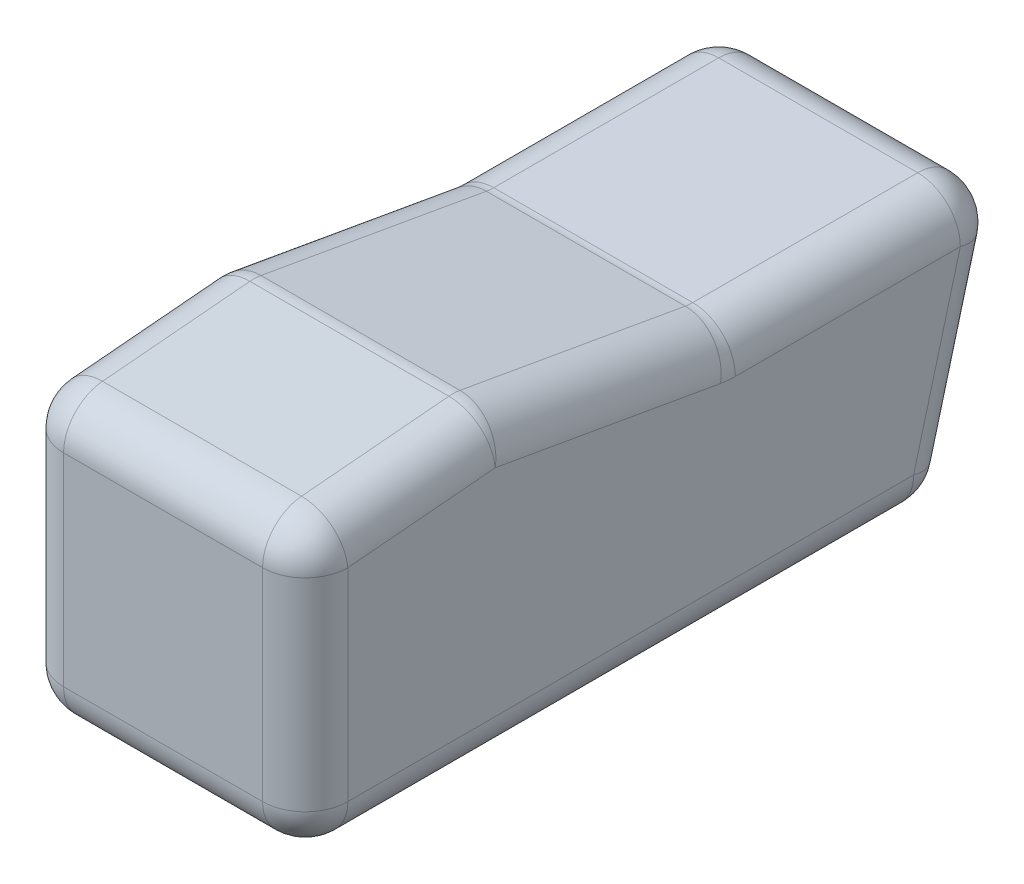
ISO-10303-21;
HEADER;
FILE_DESCRIPTION(('STEP AP214'),'2;1');
FILE_NAME('part.step','',(''),(''),'','','');
FILE_SCHEMA(('AUTOMOTIVE_DESIGN { 1 0 10303 214 1 1 1 1 }'));
ENDSEC;
DATA;
#1=APPLICATION_CONTEXT('core data for automotive mechanical design processes');
#2=APPLICATION_PROTOCOL_DEFINITION('international standard','automotive_design',2000,#1);
#3=PRODUCT_CONTEXT('',#1,'mechanical');
#4=PRODUCT('Part','Part','',(#3));
#5=PRODUCT_RELATED_PRODUCT_CATEGORY('part','',(#4));
#6=PRODUCT_DEFINITION_FORMATION('','',#4);
#7=PRODUCT_DEFINITION_CONTEXT('part definition',#1,'design');
#8=PRODUCT_DEFINITION('design','',#6,#7);
#9=PRODUCT_DEFINITION_SHAPE('','',#8);
#10=(LENGTH_UNIT() NAMED_UNIT(*) SI_UNIT(.MILLI.,.METRE.));
#11=(NAMED_UNIT(*) PLANE_ANGLE_UNIT() SI_UNIT($,.RADIAN.));
#12=(NAMED_UNIT(*) SI_UNIT($,.STERADIAN.) SOLID_ANGLE_UNIT());
#13=UNCERTAINTY_MEASURE_WITH_UNIT(LENGTH_MEASURE(1.E-05),#10,'distance_accuracy_value','');
#14=(GEOMETRIC_REPRESENTATION_CONTEXT(3) GLOBAL_UNCERTAINTY_ASSIGNED_CONTEXT((#13)) GLOBAL_UNIT_ASSIGNED_CONTEXT((#10,
#11,#12)) REPRESENTATION_CONTEXT('',''));
#15=CARTESIAN_POINT('',(0.,0.,0.));
#16=DIRECTION('',(0.,0.,1.));
#17=DIRECTION('',(1.,0.,0.));
#18=AXIS2_PLACEMENT_3D('',#15,#16,#17);
#19=CARTESIAN_POINT('',(-1000.,1000.,-500.));
#20=DIRECTION('',(0.,-0.996194698091746,-0.0871557427476548));
#21=DIRECTION('',(0.,0.0871557427476548,-0.996194698091746));
#22=AXIS2_PLACEMENT_3D('',#19,#20,#21);
#23=PLANE('',#22);
#24=DIRECTION('',(1.,0.,0.));
#25=VECTOR('',#24,1.);
#26=CARTESIAN_POINT('',(-1000.,1114.66741439645,-1810.65454397387));
#27=LINE('',#26,#25);
#28=CARTESIAN_POINT('',(700.,1114.66741439645,-1810.65454397387));
#29=VERTEX_POINT('',#28);
#30=CARTESIAN_POINT('',(-700.,1114.66741439645,-1810.65454397387));
#31=VERTEX_POINT('',#30);
#32=EDGE_CURVE('E49',#29,#31,#27,.F.);
#33=ORIENTED_EDGE('',*,*,#32,.T.);
#34=DIRECTION('',(0.,0.0871557427476548,-0.996194698091746));
#35=VECTOR('',#34,1.);
#36=CARTESIAN_POINT('',(-700.,1000.,-500.));
#37=LINE('',#36,#35);
#38=CARTESIAN_POINT('',(-700.,1023.9590572223,-773.853277175704));
#39=VERTEX_POINT('',#38);
#40=EDGE_CURVE('E11',#31,#39,#37,.F.);
#41=ORIENTED_EDGE('',*,*,#40,.T.);
#42=DIRECTION('',(1.,0.,0.));
#43=VECTOR('',#42,1.);
#44=CARTESIAN_POINT('',(-1000.,1023.9590572223,-773.853277175704));
#45=LINE('',#44,#43);
#46=CARTESIAN_POINT('',(700.,1023.9590572223,-773.853277175704));
#47=VERTEX_POINT('',#46);
#48=EDGE_CURVE('E358',#39,#47,#45,.T.);
#49=ORIENTED_EDGE('',*,*,#48,.T.);
#50=DIRECTION('',(0.,0.0871557427476548,-0.996194698091746));
#51=VECTOR('',#50,1.);
#52=CARTESIAN_POINT('',(700.,1118.10969575999,-1850.));
#53=LINE('',#52,#51);
#54=EDGE_CURVE('E60',#47,#29,#53,.T.);
#55=ORIENTED_EDGE('',*,*,#54,.T.);
#56=EDGE_LOOP('',(#33,#41,#49,#55));
#57=FACE_BOUND('',#56,.T.);
#58=ADVANCED_FACE('F39',(#57),#23,.F.);
#59=CARTESIAN_POINT('',(-1000.,1118.10969575999,-1850.));
#60=DIRECTION('',(0.,-0.984807753012207,0.173648177666934));
#61=DIRECTION('',(0.,-0.173648177666934,-0.984807753012207));
#62=AXIS2_PLACEMENT_3D('',#59,#60,#61);
#63=PLANE('',#62);
#64=DIRECTION('',(1.,0.,0.));
#65=VECTOR('',#64,1.);
#66=CARTESIAN_POINT('',(-1000.,831.727851687357,-3474.1521457577));
#67=LINE('',#66,#65);
#68=CARTESIAN_POINT('',(700.,831.727851687357,-3474.1521457577));
#69=VERTEX_POINT('',#68);
#70=CARTESIAN_POINT('',(-700.,831.727851687357,-3474.1521457577));
#71=VERTEX_POINT('',#70);
#72=EDGE_CURVE('E351',#69,#71,#67,.F.);
#73=ORIENTED_EDGE('',*,*,#72,.T.);
#74=DIRECTION('',(0.,-0.173648177666934,-0.984807753012207));
#75=VECTOR('',#74,1.);
#76=CARTESIAN_POINT('',(-700.,1118.10969575999,-1850.));
#77=LINE('',#76,#75);
#78=CARTESIAN_POINT('',(-700.,1111.25133087259,-1888.89572009825));
#79=VERTEX_POINT('',#78);
#80=EDGE_CURVE('E354',#71,#79,#77,.F.);
#81=ORIENTED_EDGE('',*,*,#80,.T.);
#82=DIRECTION('',(1.,0.,0.));
#83=VECTOR('',#82,1.);
#84=CARTESIAN_POINT('',(-1000.,1111.25133087259,-1888.89572009825));
#85=LINE('',#84,#83);
#86=CARTESIAN_POINT('',(700.,1111.25133087259,-1888.89572009825));
#87=VERTEX_POINT('',#86);
#88=EDGE_CURVE('E340',#79,#87,#85,.T.);
#89=ORIENTED_EDGE('',*,*,#88,.T.);
#90=DIRECTION('',(0.,-0.173648177666934,-0.984807753012207));
#91=VECTOR('',#90,1.);
#92=CARTESIAN_POINT('',(700.,827.170177591019,-3500.));
#93=LINE('',#92,#91);
#94=EDGE_CURVE('E344',#87,#69,#93,.T.);
#95=ORIENTED_EDGE('',*,*,#94,.T.);
#96=EDGE_LOOP('',(#73,#81,#89,#95));
#97=FACE_BOUND('',#96,.T.);
#98=ADVANCED_FACE('F513',(#97),#63,.F.);
#99=CARTESIAN_POINT('',(-1000.,827.170177591019,-3500.));
#100=DIRECTION('',(0.,-1.,0.));
#101=DIRECTION('',(0.,0.,-1.));
#102=AXIS2_PLACEMENT_3D('',#99,#100,#101);
#103=PLANE('',#102);
#104=DIRECTION('',(1.,0.,0.));
#105=VECTOR('',#104,1.);
#106=CARTESIAN_POINT('',(-1000.,827.170177591019,-5109.03238814764));
#107=LINE('',#106,#105);
#108=CARTESIAN_POINT('',(700.,827.170177591019,-5109.03238814764));
#109=VERTEX_POINT('',#108);
#110=CARTESIAN_POINT('',(-700.,827.170177591019,-5109.03238814764));
#111=VERTEX_POINT('',#110);
#112=EDGE_CURVE('E335',#109,#111,#107,.F.);
#113=ORIENTED_EDGE('',*,*,#112,.T.);
#114=DIRECTION('',(0.,0.,-1.));
#115=VECTOR('',#114,1.);
#116=CARTESIAN_POINT('',(-700.,827.170177591019,-3500.));
#117=LINE('',#116,#115);
#118=CARTESIAN_POINT('',(-700.,827.170177591019,-3526.24659905778));
#119=VERTEX_POINT('',#118);
#120=EDGE_CURVE('E332',#111,#119,#117,.F.);
#121=ORIENTED_EDGE('',*,*,#120,.T.);
#122=DIRECTION('',(1.,0.,0.));
#123=VECTOR('',#122,1.);
#124=CARTESIAN_POINT('',(1000.,827.170177591019,-3526.24659905778));
#125=LINE('',#124,#123);
#126=CARTESIAN_POINT('',(700.,827.170177591019,-3526.24659905778));
#127=VERTEX_POINT('',#126);
#128=EDGE_CURVE('E324',#119,#127,#125,.T.);
#129=ORIENTED_EDGE('',*,*,#128,.T.);
#130=DIRECTION('',(0.,0.,-1.));
#131=VECTOR('',#130,1.);
#132=CARTESIAN_POINT('',(700.,827.170177591019,-5500.));
#133=LINE('',#132,#131);
#134=EDGE_CURVE('E328',#127,#109,#133,.T.);
#135=ORIENTED_EDGE('',*,*,#134,.T.);
#136=EDGE_LOOP('',(#113,#121,#129,#135));
#137=FACE_BOUND('',#136,.T.);
#138=ADVANCED_FACE('F333',(#137),#103,.F.);
#139=CARTESIAN_POINT('',(-1000.,827.170177591019,-5500.));
#140=DIRECTION('',(0.,0.258819045102525,0.965925826289067));
#141=DIRECTION('',(0.,-0.965925826289067,0.258819045102525));
#142=AXIS2_PLACEMENT_3D('',#139,#140,#141);
#143=PLANE('',#142);
#144=DIRECTION('',(1.,0.,0.));
#145=VECTOR('',#144,1.);
#146=CARTESIAN_POINT('',(-1000.,-777.645713530757,-5069.99087797328));
#147=LINE('',#146,#145);
#148=CARTESIAN_POINT('',(700.,-777.645713530757,-5069.99087797328));
#149=VERTEX_POINT('',#148);
#150=CARTESIAN_POINT('',(-700.,-777.645713530757,-5069.99087797328));
#151=VERTEX_POINT('',#150);
#152=EDGE_CURVE('E441',#149,#151,#147,.F.);
#153=ORIENTED_EDGE('',*,*,#152,.T.);
#154=DIRECTION('',(0.,-0.965925826289067,0.258819045102525));
#155=VECTOR('',#154,1.);
#156=CARTESIAN_POINT('',(-700.,827.170177591019,-5500.));
#157=LINE('',#156,#155);
#158=CARTESIAN_POINT('',(-700.,449.524464060261,-5398.81013603436));
#159=VERTEX_POINT('',#158);
#160=EDGE_CURVE('E444',#151,#159,#157,.F.);
#161=ORIENTED_EDGE('',*,*,#160,.T.);
#162=DIRECTION('',(1.,0.,0.));
#163=VECTOR('',#162,1.);
#164=CARTESIAN_POINT('',(-1000.,449.524464060261,-5398.81013603436));
#165=LINE('',#164,#163);
#166=CARTESIAN_POINT('',(700.,449.524464060261,-5398.81013603436));
#167=VERTEX_POINT('',#166);
#168=EDGE_CURVE('E435',#159,#167,#165,.T.);
#169=ORIENTED_EDGE('',*,*,#168,.T.);
#170=DIRECTION('',(0.,-0.965925826289067,0.258819045102525));
#171=VECTOR('',#170,1.);
#172=CARTESIAN_POINT('',(700.,-1000.,-5010.41122648025));
#173=LINE('',#172,#171);
#174=EDGE_CURVE('E438',#167,#149,#173,.T.);
#175=ORIENTED_EDGE('',*,*,#174,.T.);
#176=EDGE_LOOP('',(#153,#161,#169,#175));
#177=FACE_BOUND('',#176,.T.);
#178=ADVANCED_FACE('F488',(#177),#143,.F.);
#179=CARTESIAN_POINT('',(-1000.,-1000.,-5010.41122648025));
#180=DIRECTION('',(0.,1.,0.));
#181=DIRECTION('',(0.,0.,1.));
#182=AXIS2_PLACEMENT_3D('',#179,#180,#181);
#183=PLANE('',#182);
#184=DIRECTION('',(0.,0.,1.));
#185=VECTOR('',#184,1.);
#186=CARTESIAN_POINT('',(700.,-1000.,-500.));
#187=LINE('',#186,#185);
#188=CARTESIAN_POINT('',(700.,-1000.,-4780.21313008656));
#189=VERTEX_POINT('',#188);
#190=CARTESIAN_POINT('',(700.,-1000.,-800.));
#191=VERTEX_POINT('',#190);
#192=EDGE_CURVE('E405',#189,#191,#187,.T.);
#193=ORIENTED_EDGE('',*,*,#192,.T.);
#194=DIRECTION('',(1.,0.,0.));
#195=VECTOR('',#194,1.);
#196=CARTESIAN_POINT('',(-1000.,-1000.,-800.));
#197=LINE('',#196,#195);
#198=CARTESIAN_POINT('',(-700.,-1000.,-800.));
#199=VERTEX_POINT('',#198);
#200=EDGE_CURVE('E399',#191,#199,#197,.F.);
#201=ORIENTED_EDGE('',*,*,#200,.T.);
#202=DIRECTION('',(0.,0.,1.));
#203=VECTOR('',#202,1.);
#204=CARTESIAN_POINT('',(-700.,-1000.,-5010.41122648025));
#205=LINE('',#204,#203);
#206=CARTESIAN_POINT('',(-700.,-1000.,-4780.21313008656));
#207=VERTEX_POINT('',#206);
#208=EDGE_CURVE('E392',#199,#207,#205,.F.);
#209=ORIENTED_EDGE('',*,*,#208,.T.);
#210=DIRECTION('',(1.,0.,0.));
#211=VECTOR('',#210,1.);
#212=CARTESIAN_POINT('',(-1000.,-1000.,-4780.21313008656));
#213=LINE('',#212,#211);
#214=EDGE_CURVE('E400',#207,#189,#213,.T.);
#215=ORIENTED_EDGE('',*,*,#214,.T.);
#216=EDGE_LOOP('',(#193,#201,#209,#215));
#217=FACE_BOUND('',#216,.T.);
#218=ADVANCED_FACE('F403',(#217),#183,.F.);
#219=CARTESIAN_POINT('',(-1000.,-1000.,-500.));
#220=DIRECTION('',(0.,0.,-1.));
#221=DIRECTION('',(-1.,0.,0.));
#222=AXIS2_PLACEMENT_3D('',#219,#220,#221);
#223=PLANE('',#222);
#224=DIRECTION('',(0.,1.,0.));
#225=VECTOR('',#224,1.);
#226=CARTESIAN_POINT('',(-700.,-1000.,-500.));
#227=LINE('',#226,#225);
#228=CARTESIAN_POINT('',(-700.,725.100647794772,-500.));
#229=VERTEX_POINT('',#228);
#230=CARTESIAN_POINT('',(-700.,-700.,-500.));
#231=VERTEX_POINT('',#230);
#232=EDGE_CURVE('E181',#229,#231,#227,.F.);
#233=ORIENTED_EDGE('',*,*,#232,.T.);
#234=DIRECTION('',(1.,0.,0.));
#235=VECTOR('',#234,1.);
#236=CARTESIAN_POINT('',(-1000.,-700.,-500.));
#237=LINE('',#236,#235);
#238=CARTESIAN_POINT('',(700.,-700.,-500.));
#239=VERTEX_POINT('',#238);
#240=EDGE_CURVE('E176',#231,#239,#237,.T.);
#241=ORIENTED_EDGE('',*,*,#240,.T.);
#242=DIRECTION('',(0.,1.,0.));
#243=VECTOR('',#242,1.);
#244=CARTESIAN_POINT('',(700.,1000.,-500.));
#245=LINE('',#244,#243);
#246=CARTESIAN_POINT('',(700.,725.100647794772,-500.));
#247=VERTEX_POINT('',#246);
#248=EDGE_CURVE('E170',#239,#247,#245,.T.);
#249=ORIENTED_EDGE('',*,*,#248,.T.);
#250=DIRECTION('',(1.,0.,0.));
#251=VECTOR('',#250,1.);
#252=CARTESIAN_POINT('',(-1000.,725.100647794772,-500.));
#253=LINE('',#252,#251);
#254=EDGE_CURVE('E173',#247,#229,#253,.F.);
#255=ORIENTED_EDGE('',*,*,#254,.T.);
#256=EDGE_LOOP('',(#233,#241,#249,#255));
#257=FACE_BOUND('',#256,.T.);
#258=ADVANCED_FACE('F172',(#257),#223,.F.);
#259=CARTESIAN_POINT('',(-1000.,0.,0.));
#260=DIRECTION('',(1.,0.,0.));
#261=DIRECTION('',(0.,0.,-1.));
#262=AXIS2_PLACEMENT_3D('',#259,#260,#261);
#263=PLANE('',#262);
#264=DIRECTION('',(0.,-0.965925826289067,0.258819045102525));
#265=VECTOR('',#264,1.);
#266=CARTESIAN_POINT('',(-1000.,-1241.9443911971,-4634.99956812272));
#267=LINE('',#266,#265);
#268=CARTESIAN_POINT('',(-1000.,527.170177591019,-5109.03238814764));
#269=VERTEX_POINT('',#268);
#270=CARTESIAN_POINT('',(-1000.,-700.,-4780.21313008656));
#271=VERTEX_POINT('',#270);
#272=EDGE_CURVE('E429',#269,#271,#267,.T.);
#273=ORIENTED_EDGE('',*,*,#272,.T.);
#274=DIRECTION('',(0.,0.,1.));
#275=VECTOR('',#274,1.);
#276=CARTESIAN_POINT('',(-1000.,-700.,0.));
#277=LINE('',#276,#275);
#278=CARTESIAN_POINT('',(-1000.,-700.,-800.));
#279=VERTEX_POINT('',#278);
#280=EDGE_CURVE('E432',#271,#279,#277,.T.);
#281=ORIENTED_EDGE('',*,*,#280,.T.);
#282=DIRECTION('',(0.,1.,0.));
#283=VECTOR('',#282,1.);
#284=CARTESIAN_POINT('',(-1000.,0.,-800.));
#285=LINE('',#284,#283);
#286=CARTESIAN_POINT('',(-1000.,725.100647794772,-800.));
#287=VERTEX_POINT('',#286);
#288=EDGE_CURVE('E419',#279,#287,#285,.T.);
#289=ORIENTED_EDGE('',*,*,#288,.T.);
#290=DIRECTION('',(0.,0.0871557427476548,-0.996194698091746));
#291=VECTOR('',#290,1.);
#292=CARTESIAN_POINT('',(-1000.,650.13342266185,56.8793042622177));
#293=LINE('',#292,#291);
#294=CARTESIAN_POINT('',(-1000.,815.809004968925,-1836.80126679817));
#295=VERTEX_POINT('',#294);
#296=EDGE_CURVE('E410',#287,#295,#293,.T.);
#297=ORIENTED_EDGE('',*,*,#296,.T.);
#298=DIRECTION('',(0.,-0.173648177666934,-0.984807753012207));
#299=VECTOR('',#298,1.);
#300=CARTESIAN_POINT('',(-1000.,1105.32086972,-194.897891671787));
#301=LINE('',#300,#299);
#302=CARTESIAN_POINT('',(-1000.,536.285525783694,-3422.05769245762));
#303=VERTEX_POINT('',#302);
#304=EDGE_CURVE('E413',#295,#303,#301,.T.);
#305=ORIENTED_EDGE('',*,*,#304,.T.);
#306=CARTESIAN_POINT('',(-1000.,1127.17017759102,-3526.24659905778));
#307=DIRECTION('',(1.,0.,0.));
#308=DIRECTION('',(0.,0.,-1.));
#309=AXIS2_PLACEMENT_3D('',#306,#307,#308);
#310=CIRCLE('',#309,600.);
#311=CARTESIAN_POINT('',(-1000.,527.170177591019,-3526.24659905778));
#312=VERTEX_POINT('',#311);
#313=EDGE_CURVE('E423',#312,#303,#310,.F.);
#314=ORIENTED_EDGE('',*,*,#313,.F.);
#315=DIRECTION('',(0.,0.,-1.));
#316=VECTOR('',#315,1.);
#317=CARTESIAN_POINT('',(-1000.,527.170177591018,0.));
#318=LINE('',#317,#316);
#319=EDGE_CURVE('E426',#312,#269,#318,.T.);
#320=ORIENTED_EDGE('',*,*,#319,.T.);
#321=EDGE_LOOP('',(#273,#281,#289,#297,#305,#314,#320));
#322=FACE_BOUND('',#321,.T.);
#323=ADVANCED_FACE('F506',(#322),#263,.F.);
#324=CARTESIAN_POINT('',(1000.,0.,0.));
#325=DIRECTION('',(1.,0.,0.));
#326=DIRECTION('',(0.,0.,-1.));
#327=AXIS2_PLACEMENT_3D('',#324,#325,#326);
#328=PLANE('',#327);
#329=DIRECTION('',(0.,0.,1.));
#330=VECTOR('',#329,1.);
#331=CARTESIAN_POINT('',(1000.,-700.,-5010.41122648025));
#332=LINE('',#331,#330);
#333=CARTESIAN_POINT('',(1000.,-700.,-800.));
#334=VERTEX_POINT('',#333);
#335=CARTESIAN_POINT('',(1000.,-700.,-4780.21313008656));
#336=VERTEX_POINT('',#335);
#337=EDGE_CURVE('E463',#334,#336,#332,.F.);
#338=ORIENTED_EDGE('',*,*,#337,.T.);
#339=DIRECTION('',(0.,-0.965925826289067,0.258819045102525));
#340=VECTOR('',#339,1.);
#341=CARTESIAN_POINT('',(1000.,904.815891121777,-5210.22225211328));
#342=LINE('',#341,#340);
#343=CARTESIAN_POINT('',(1000.,527.170177591019,-5109.03238814764));
#344=VERTEX_POINT('',#343);
#345=EDGE_CURVE('E329',#336,#344,#342,.F.);
#346=ORIENTED_EDGE('',*,*,#345,.T.);
#347=DIRECTION('',(0.,0.,-1.));
#348=VECTOR('',#347,1.);
#349=CARTESIAN_POINT('',(1000.,527.170177591019,-3500.));
#350=LINE('',#349,#348);
#351=CARTESIAN_POINT('',(1000.,527.170177591019,-3526.24659905778));
#352=VERTEX_POINT('',#351);
#353=EDGE_CURVE('E458',#344,#352,#350,.F.);
#354=ORIENTED_EDGE('',*,*,#353,.T.);
#355=CARTESIAN_POINT('',(1000.,1127.17017759102,-3526.24659905778));
#356=DIRECTION('',(1.,0.,0.));
#357=DIRECTION('',(0.,0.,-1.));
#358=AXIS2_PLACEMENT_3D('',#355,#356,#357);
#359=CIRCLE('',#358,600.);
#360=CARTESIAN_POINT('',(1000.,536.285525783694,-3422.05769245762));
#361=VERTEX_POINT('',#360);
#362=EDGE_CURVE('E454',#361,#352,#359,.T.);
#363=ORIENTED_EDGE('',*,*,#362,.F.);
#364=DIRECTION('',(0.,-0.173648177666934,-0.984807753012207));
#365=VECTOR('',#364,1.);
#366=CARTESIAN_POINT('',(1000.,822.667369856331,-1797.90554669992));
#367=LINE('',#366,#365);
#368=CARTESIAN_POINT('',(1000.,815.809004968925,-1836.80126679817));
#369=VERTEX_POINT('',#368);
#370=EDGE_CURVE('E451',#361,#369,#367,.F.);
#371=ORIENTED_EDGE('',*,*,#370,.T.);
#372=DIRECTION('',(0.,0.0871557427476548,-0.996194698091746));
#373=VECTOR('',#372,1.);
#374=CARTESIAN_POINT('',(1000.,701.141590572476,-526.146722824296));
#375=LINE('',#374,#373);
#376=CARTESIAN_POINT('',(1000.,725.100647794772,-800.));
#377=VERTEX_POINT('',#376);
#378=EDGE_CURVE('E448',#369,#377,#375,.F.);
#379=ORIENTED_EDGE('',*,*,#378,.T.);
#380=DIRECTION('',(0.,1.,0.));
#381=VECTOR('',#380,1.);
#382=CARTESIAN_POINT('',(1000.,-1000.,-800.));
#383=LINE('',#382,#381);
#384=EDGE_CURVE('E204',#377,#334,#383,.F.);
#385=ORIENTED_EDGE('',*,*,#384,.T.);
#386=EDGE_LOOP('',(#338,#346,#354,#363,#371,#379,#385));
#387=FACE_BOUND('',#386,.T.);
#388=ADVANCED_FACE('F529',(#387),#328,.T.);
#389=CARTESIAN_POINT('',(-1000.,1127.17017759102,-3526.24659905778));
#390=DIRECTION('',(-1.,0.,0.));
#391=DIRECTION('',(0.,0.,1.));
#392=AXIS2_PLACEMENT_3D('',#389,#390,#391);
#393=CYLINDRICAL_SURFACE('',#392,300.);
#394=CARTESIAN_POINT('',(-700.,1127.17017759102,-3526.24659905778));
#395=DIRECTION('',(1.,0.,0.));
#396=DIRECTION('',(0.,0.,-1.));
#397=AXIS2_PLACEMENT_3D('',#394,#395,#396);
#398=CIRCLE('',#397,300.);
#399=EDGE_CURVE('E43',#71,#119,#398,.T.);
#400=ORIENTED_EDGE('',*,*,#399,.F.);
#401=ORIENTED_EDGE('',*,*,#72,.F.);
#402=CARTESIAN_POINT('',(700.,1127.17017759102,-3526.24659905778));
#403=DIRECTION('',(1.,0.,0.));
#404=DIRECTION('',(0.,0.,-1.));
#405=AXIS2_PLACEMENT_3D('',#402,#403,#404);
#406=CIRCLE('',#405,300.);
#407=EDGE_CURVE('E304',#127,#69,#406,.F.);
#408=ORIENTED_EDGE('',*,*,#407,.F.);
#409=ORIENTED_EDGE('',*,*,#128,.F.);
#410=EDGE_LOOP('',(#400,#401,#408,#409));
#411=FACE_BOUND('',#410,.T.);
#412=ADVANCED_FACE('F41',(#411),#393,.F.);
#413=CARTESIAN_POINT('',(-700.,1127.17017759102,-3526.24659905778));
#414=DIRECTION('',(1.,0.,0.));
#415=DIRECTION('',(0.,0.,-1.));
#416=AXIS2_PLACEMENT_3D('',#413,#414,#415);
#417=TOROIDAL_SURFACE('',#416,600.,300.);
#418=CARTESIAN_POINT('',(-700.,536.285525783694,-3422.05769245762));
#419=DIRECTION('',(0.,-0.173648177666935,-0.984807753012207));
#420=DIRECTION('',(0.,0.984807753012207,-0.173648177666935));
#421=AXIS2_PLACEMENT_3D('',#418,#419,#420);
#422=CIRCLE('',#421,300.);
#423=EDGE_CURVE('E298',#71,#303,#422,.F.);
#424=ORIENTED_EDGE('',*,*,#423,.F.);
#425=ORIENTED_EDGE('',*,*,#399,.T.);
#426=CARTESIAN_POINT('',(-700.,527.170177591019,-3526.24659905778));
#427=DIRECTION('',(0.,0.,1.));
#428=DIRECTION('',(1.,0.,0.));
#429=AXIS2_PLACEMENT_3D('',#426,#427,#428);
#430=CIRCLE('',#429,300.);
#431=EDGE_CURVE('E302',#312,#119,#430,.F.);
#432=ORIENTED_EDGE('',*,*,#431,.F.);
#433=ORIENTED_EDGE('',*,*,#313,.T.);
#434=EDGE_LOOP('',(#424,#425,#432,#433));
#435=FACE_BOUND('',#434,.T.);
#436=ADVANCED_FACE('F318',(#435),#417,.T.);
#437=CARTESIAN_POINT('',(700.,1127.17017759102,-3526.24659905778));
#438=DIRECTION('',(1.,0.,0.));
#439=DIRECTION('',(0.,0.,-1.));
#440=AXIS2_PLACEMENT_3D('',#437,#438,#439);
#441=TOROIDAL_SURFACE('',#440,600.,300.);
#442=CARTESIAN_POINT('',(700.,527.170177591019,-3526.24659905778));
#443=DIRECTION('',(0.,0.,1.));
#444=DIRECTION('',(1.,0.,0.));
#445=AXIS2_PLACEMENT_3D('',#442,#443,#444);
#446=CIRCLE('',#445,300.);
#447=EDGE_CURVE('E290',#127,#352,#446,.F.);
#448=ORIENTED_EDGE('',*,*,#447,.F.);
#449=ORIENTED_EDGE('',*,*,#407,.T.);
#450=CARTESIAN_POINT('',(700.,536.285525783695,-3422.05769245762));
#451=DIRECTION('',(0.,-0.173648177666935,-0.984807753012207));
#452=DIRECTION('',(0.,0.984807753012207,-0.173648177666935));
#453=AXIS2_PLACEMENT_3D('',#450,#451,#452);
#454=CIRCLE('',#453,300.);
#455=EDGE_CURVE('E294',#361,#69,#454,.F.);
#456=ORIENTED_EDGE('',*,*,#455,.F.);
#457=ORIENTED_EDGE('',*,*,#362,.T.);
#458=EDGE_LOOP('',(#448,#449,#456,#457));
#459=FACE_BOUND('',#458,.T.);
#460=ADVANCED_FACE('F531',(#459),#441,.T.);
#461=CARTESIAN_POINT('',(-700.,527.170177591018,0.));
#462=DIRECTION('',(0.,0.,-1.));
#463=DIRECTION('',(0.,1.,0.));
#464=AXIS2_PLACEMENT_3D('',#461,#462,#463);
#465=CYLINDRICAL_SURFACE('',#464,300.);
#466=ORIENTED_EDGE('',*,*,#431,.T.);
#467=ORIENTED_EDGE('',*,*,#120,.F.);
#468=CARTESIAN_POINT('',(-700.,527.170177591019,-5109.03238814764));
#469=DIRECTION('',(0.,0.,-1.));
#470=DIRECTION('',(-1.,0.,0.));
#471=AXIS2_PLACEMENT_3D('',#468,#469,#470);
#472=CIRCLE('',#471,300.);
#473=EDGE_CURVE('E282',#269,#111,#472,.T.);
#474=ORIENTED_EDGE('',*,*,#473,.F.);
#475=ORIENTED_EDGE('',*,*,#319,.F.);
#476=EDGE_LOOP('',(#466,#467,#474,#475));
#477=FACE_BOUND('',#476,.T.);
#478=ADVANCED_FACE('F504',(#477),#465,.T.);
#479=CARTESIAN_POINT('',(-700.,1105.32086972,-194.897891671788));
#480=DIRECTION('',(0.,-0.173648177666934,-0.984807753012207));
#481=DIRECTION('',(0.,0.984807753012207,-0.173648177666934));
#482=AXIS2_PLACEMENT_3D('',#479,#480,#481);
#483=CYLINDRICAL_SURFACE('',#482,300.);
#484=ORIENTED_EDGE('',*,*,#423,.T.);
#485=ORIENTED_EDGE('',*,*,#304,.F.);
#486=CARTESIAN_POINT('',(-700.,815.809004968925,-1836.80126679817));
#487=DIRECTION('',(0.,0.173648177666934,0.984807753012207));
#488=DIRECTION('',(0.,-0.984807753012208,0.173648177666934));
#489=AXIS2_PLACEMENT_3D('',#486,#487,#488);
#490=CIRCLE('',#489,300.);
#491=EDGE_CURVE('E278',#79,#295,#490,.T.);
#492=ORIENTED_EDGE('',*,*,#491,.F.);
#493=ORIENTED_EDGE('',*,*,#80,.F.);
#494=EDGE_LOOP('',(#484,#485,#492,#493));
#495=FACE_BOUND('',#494,.T.);
#496=ADVANCED_FACE('F509',(#495),#483,.T.);
#497=CARTESIAN_POINT('',(-1000.,815.809004968925,-1836.80126679817));
#498=DIRECTION('',(1.,0.,0.));
#499=DIRECTION('',(0.,0.,-1.));
#500=AXIS2_PLACEMENT_3D('',#497,#498,#499);
#501=CYLINDRICAL_SURFACE('',#500,300.);
#502=CARTESIAN_POINT('',(700.,815.809004968925,-1836.80126679817));
#503=DIRECTION('',(1.,0.,0.));
#504=DIRECTION('',(0.,0.,-1.));
#505=AXIS2_PLACEMENT_3D('',#502,#503,#504);
#506=CIRCLE('',#505,300.);
#507=EDGE_CURVE('E271',#87,#29,#506,.T.);
#508=ORIENTED_EDGE('',*,*,#507,.F.);
#509=ORIENTED_EDGE('',*,*,#88,.F.);
#510=CARTESIAN_POINT('',(-700.,815.809004968925,-1836.80126679817));
#511=DIRECTION('',(-1.,0.,0.));
#512=DIRECTION('',(0.,0.,1.));
#513=AXIS2_PLACEMENT_3D('',#510,#511,#512);
#514=CIRCLE('',#513,300.);
#515=EDGE_CURVE('E275',#31,#79,#514,.T.);
#516=ORIENTED_EDGE('',*,*,#515,.F.);
#517=ORIENTED_EDGE('',*,*,#32,.F.);
#518=EDGE_LOOP('',(#508,#509,#516,#517));
#519=FACE_BOUND('',#518,.T.);
#520=ADVANCED_FACE('F522',(#519),#501,.T.);
#521=CARTESIAN_POINT('',(700.,822.667369856331,-1797.90554669992));
#522=DIRECTION('',(0.,0.173648177666934,0.984807753012207));
#523=DIRECTION('',(0.,-0.984807753012207,0.173648177666934));
#524=AXIS2_PLACEMENT_3D('',#521,#522,#523);
#525=CYLINDRICAL_SURFACE('',#524,300.);
#526=ORIENTED_EDGE('',*,*,#455,.T.);
#527=ORIENTED_EDGE('',*,*,#94,.F.);
#528=CARTESIAN_POINT('',(700.,815.809004968925,-1836.80126679817));
#529=DIRECTION('',(0.,0.173648177666934,0.984807753012207));
#530=DIRECTION('',(0.,-0.984807753012208,0.173648177666934));
#531=AXIS2_PLACEMENT_3D('',#528,#529,#530);
#532=CIRCLE('',#531,300.);
#533=EDGE_CURVE('E267',#369,#87,#532,.T.);
#534=ORIENTED_EDGE('',*,*,#533,.F.);
#535=ORIENTED_EDGE('',*,*,#370,.F.);
#536=EDGE_LOOP('',(#526,#527,#534,#535));
#537=FACE_BOUND('',#536,.T.);
#538=ADVANCED_FACE('F518',(#537),#525,.T.);
#539=CARTESIAN_POINT('',(700.,527.170177591019,-3500.));
#540=DIRECTION('',(0.,0.,1.));
#541=DIRECTION('',(0.,-1.,0.));
#542=AXIS2_PLACEMENT_3D('',#539,#540,#541);
#543=CYLINDRICAL_SURFACE('',#542,300.);
#544=ORIENTED_EDGE('',*,*,#447,.T.);
#545=ORIENTED_EDGE('',*,*,#353,.F.);
#546=CARTESIAN_POINT('',(700.,527.170177591019,-5109.03238814764));
#547=DIRECTION('',(0.,0.,-1.));
#548=DIRECTION('',(-1.,0.,0.));
#549=AXIS2_PLACEMENT_3D('',#546,#547,#548);
#550=CIRCLE('',#549,300.);
#551=EDGE_CURVE('E263',#109,#344,#550,.T.);
#552=ORIENTED_EDGE('',*,*,#551,.F.);
#553=ORIENTED_EDGE('',*,*,#134,.F.);
#554=EDGE_LOOP('',(#544,#545,#552,#553));
#555=FACE_BOUND('',#554,.T.);
#556=ADVANCED_FACE('F478',(#555),#543,.T.);
#557=CARTESIAN_POINT('',(-1000.,527.170177591019,-5109.03238814764));
#558=DIRECTION('',(1.,0.,0.));
#559=DIRECTION('',(0.,0.,-1.));
#560=AXIS2_PLACEMENT_3D('',#557,#558,#559);
#561=CYLINDRICAL_SURFACE('',#560,300.);
#562=CARTESIAN_POINT('',(-700.,527.170177591019,-5109.03238814764));
#563=DIRECTION('',(-1.,0.,0.));
#564=DIRECTION('',(0.,0.,1.));
#565=AXIS2_PLACEMENT_3D('',#562,#563,#564);
#566=CIRCLE('',#565,300.);
#567=EDGE_CURVE('E286',#111,#159,#566,.T.);
#568=ORIENTED_EDGE('',*,*,#567,.F.);
#569=ORIENTED_EDGE('',*,*,#112,.F.);
#570=CARTESIAN_POINT('',(700.,527.170177591019,-5109.03238814764));
#571=DIRECTION('',(1.,0.,0.));
#572=DIRECTION('',(0.,0.,-1.));
#573=AXIS2_PLACEMENT_3D('',#570,#571,#572);
#574=CIRCLE('',#573,300.);
#575=EDGE_CURVE('E259',#167,#109,#574,.T.);
#576=ORIENTED_EDGE('',*,*,#575,.F.);
#577=ORIENTED_EDGE('',*,*,#168,.F.);
#578=EDGE_LOOP('',(#568,#569,#576,#577));
#579=FACE_BOUND('',#578,.T.);
#580=ADVANCED_FACE('F474',(#579),#561,.T.);
#581=CARTESIAN_POINT('',(-700.,527.170177591019,-5109.03238814764));
#582=DIRECTION('',(-1.,0.,0.));
#583=DIRECTION('',(0.,-1.,0.));
#584=AXIS2_PLACEMENT_3D('',#581,#582,#583);
#585=SPHERICAL_SURFACE('',#584,300.);
#586=ORIENTED_EDGE('',*,*,#473,.T.);
#587=ORIENTED_EDGE('',*,*,#567,.T.);
#588=CARTESIAN_POINT('',(-700.,527.170177591019,-5109.03238814764));
#589=DIRECTION('',(0.,0.965925826289067,-0.258819045102524));
#590=DIRECTION('',(0.,0.258819045102524,0.965925826289067));
#591=AXIS2_PLACEMENT_3D('',#588,#589,#590);
#592=CIRCLE('',#591,300.);
#593=EDGE_CURVE('E256',#269,#159,#592,.F.);
#594=ORIENTED_EDGE('',*,*,#593,.F.);
#595=EDGE_LOOP('',(#586,#587,#594));
#596=FACE_BOUND('',#595,.T.);
#597=ADVANCED_FACE('F503',(#596),#585,.T.);
#598=CARTESIAN_POINT('',(-700.,815.809004968925,-1836.80126679817));
#599=DIRECTION('',(-1.,0.,0.));
#600=DIRECTION('',(0.,0.,1.));
#601=AXIS2_PLACEMENT_3D('',#598,#599,#600);
#602=SPHERICAL_SURFACE('',#601,300.);
#603=ORIENTED_EDGE('',*,*,#515,.T.);
#604=ORIENTED_EDGE('',*,*,#491,.T.);
#605=CARTESIAN_POINT('',(-700.,815.809004968925,-1836.80126679817));
#606=DIRECTION('',(0.,0.087155742747654,-0.996194698091746));
#607=DIRECTION('',(0.,0.996194698091746,0.087155742747654));
#608=AXIS2_PLACEMENT_3D('',#605,#606,#607);
#609=CIRCLE('',#608,300.);
#610=EDGE_CURVE('E252',#31,#295,#609,.F.);
#611=ORIENTED_EDGE('',*,*,#610,.F.);
#612=EDGE_LOOP('',(#603,#604,#611));
#613=FACE_BOUND('',#612,.T.);
#614=ADVANCED_FACE('F598',(#613),#602,.T.);
#615=CARTESIAN_POINT('',(700.,815.809004968925,-1836.80126679817));
#616=DIRECTION('',(1.,0.,0.));
#617=DIRECTION('',(0.,1.,0.));
#618=AXIS2_PLACEMENT_3D('',#615,#616,#617);
#619=SPHERICAL_SURFACE('',#618,300.);
#620=ORIENTED_EDGE('',*,*,#533,.T.);
#621=ORIENTED_EDGE('',*,*,#507,.T.);
#622=CARTESIAN_POINT('',(700.,815.809004968925,-1836.80126679817));
#623=DIRECTION('',(0.,0.0871557427476547,-0.996194698091746));
#624=DIRECTION('',(0.,0.996194698091746,0.0871557427476547));
#625=AXIS2_PLACEMENT_3D('',#622,#623,#624);
#626=CIRCLE('',#625,300.);
#627=EDGE_CURVE('E248',#369,#29,#626,.F.);
#628=ORIENTED_EDGE('',*,*,#627,.F.);
#629=EDGE_LOOP('',(#620,#621,#628));
#630=FACE_BOUND('',#629,.T.);
#631=ADVANCED_FACE('F524',(#630),#619,.T.);
#632=CARTESIAN_POINT('',(700.,527.170177591019,-5109.03238814764));
#633=DIRECTION('',(1.,0.,0.));
#634=DIRECTION('',(0.,1.,0.));
#635=AXIS2_PLACEMENT_3D('',#632,#633,#634);
#636=SPHERICAL_SURFACE('',#635,300.);
#637=ORIENTED_EDGE('',*,*,#575,.T.);
#638=ORIENTED_EDGE('',*,*,#551,.T.);
#639=CARTESIAN_POINT('',(700.,527.170177591019,-5109.03238814764));
#640=DIRECTION('',(0.,0.965925826289067,-0.258819045102525));
#641=DIRECTION('',(0.,0.258819045102525,0.965925826289067));
#642=AXIS2_PLACEMENT_3D('',#639,#640,#641);
#643=CIRCLE('',#642,300.);
#644=EDGE_CURVE('E245',#167,#344,#643,.F.);
#645=ORIENTED_EDGE('',*,*,#644,.F.);
#646=EDGE_LOOP('',(#637,#638,#645));
#647=FACE_BOUND('',#646,.T.);
#648=ADVANCED_FACE('F480',(#647),#636,.T.);
#649=CARTESIAN_POINT('',(-700.,-1241.9443911971,-4634.99956812272));
#650=DIRECTION('',(0.,-0.965925826289067,0.258819045102525));
#651=DIRECTION('',(0.,-0.258819045102525,-0.965925826289067));
#652=AXIS2_PLACEMENT_3D('',#649,#650,#651);
#653=CYLINDRICAL_SURFACE('',#652,300.);
#654=ORIENTED_EDGE('',*,*,#593,.T.);
#655=ORIENTED_EDGE('',*,*,#160,.F.);
#656=CARTESIAN_POINT('',(-700.,-700.,-4780.21313008656));
#657=DIRECTION('',(0.,-0.965925826289067,0.258819045102525));
#658=DIRECTION('',(0.,-0.258819045102525,-0.965925826289067));
#659=AXIS2_PLACEMENT_3D('',#656,#657,#658);
#660=CIRCLE('',#659,300.);
#661=EDGE_CURVE('E237',#271,#151,#660,.T.);
#662=ORIENTED_EDGE('',*,*,#661,.F.);
#663=ORIENTED_EDGE('',*,*,#272,.F.);
#664=EDGE_LOOP('',(#654,#655,#662,#663));
#665=FACE_BOUND('',#664,.T.);
#666=ADVANCED_FACE('F500',(#665),#653,.T.);
#667=CARTESIAN_POINT('',(-700.,650.13342266185,56.8793042622177));
#668=DIRECTION('',(0.,0.0871557427476548,-0.996194698091746));
#669=DIRECTION('',(0.,0.996194698091746,0.0871557427476548));
#670=AXIS2_PLACEMENT_3D('',#667,#668,#669);
#671=CYLINDRICAL_SURFACE('',#670,300.);
#672=ORIENTED_EDGE('',*,*,#610,.T.);
#673=ORIENTED_EDGE('',*,*,#296,.F.);
#674=CARTESIAN_POINT('',(-700.,725.100647794772,-800.));
#675=DIRECTION('',(0.,-0.0871557427476547,0.996194698091746));
#676=DIRECTION('',(0.,-0.996194698091746,-0.0871557427476547));
#677=AXIS2_PLACEMENT_3D('',#674,#675,#676);
#678=CIRCLE('',#677,300.);
#679=EDGE_CURVE('E233',#39,#287,#678,.T.);
#680=ORIENTED_EDGE('',*,*,#679,.F.);
#681=ORIENTED_EDGE('',*,*,#40,.F.);
#682=EDGE_LOOP('',(#672,#673,#680,#681));
#683=FACE_BOUND('',#682,.T.);
#684=ADVANCED_FACE('F588',(#683),#671,.T.);
#685=CARTESIAN_POINT('',(-1000.,725.100647794772,-800.));
#686=DIRECTION('',(1.,0.,0.));
#687=DIRECTION('',(0.,0.,-1.));
#688=AXIS2_PLACEMENT_3D('',#685,#686,#687);
#689=CYLINDRICAL_SURFACE('',#688,300.);
#690=CARTESIAN_POINT('',(700.,725.100647794772,-800.));
#691=DIRECTION('',(1.,0.,0.));
#692=DIRECTION('',(0.,0.,-1.));
#693=AXIS2_PLACEMENT_3D('',#690,#691,#692);
#694=CIRCLE('',#693,300.);
#695=EDGE_CURVE('E188',#47,#247,#694,.T.);
#696=ORIENTED_EDGE('',*,*,#695,.F.);
#697=ORIENTED_EDGE('',*,*,#48,.F.);
#698=CARTESIAN_POINT('',(-700.,725.100647794772,-800.));
#699=DIRECTION('',(-1.,0.,0.));
#700=DIRECTION('',(0.,0.,1.));
#701=AXIS2_PLACEMENT_3D('',#698,#699,#700);
#702=CIRCLE('',#701,300.);
#703=EDGE_CURVE('E190',#229,#39,#702,.T.);
#704=ORIENTED_EDGE('',*,*,#703,.F.);
#705=ORIENTED_EDGE('',*,*,#254,.F.);
#706=EDGE_LOOP('',(#696,#697,#704,#705));
#707=FACE_BOUND('',#706,.T.);
#708=ADVANCED_FACE('F186',(#707),#689,.T.);
#709=CARTESIAN_POINT('',(700.,701.141590572476,-526.146722824296));
#710=DIRECTION('',(0.,-0.0871557427476548,0.996194698091746));
#711=DIRECTION('',(0.,-0.996194698091746,-0.0871557427476548));
#712=AXIS2_PLACEMENT_3D('',#709,#710,#711);
#713=CYLINDRICAL_SURFACE('',#712,300.);
#714=ORIENTED_EDGE('',*,*,#627,.T.);
#715=ORIENTED_EDGE('',*,*,#54,.F.);
#716=CARTESIAN_POINT('',(700.,725.100647794772,-800.));
#717=DIRECTION('',(0.,-0.0871557427476547,0.996194698091746));
#718=DIRECTION('',(0.,-0.996194698091746,-0.0871557427476547));
#719=AXIS2_PLACEMENT_3D('',#716,#717,#718);
#720=CIRCLE('',#719,300.);
#721=EDGE_CURVE('E200',#377,#47,#720,.T.);
#722=ORIENTED_EDGE('',*,*,#721,.F.);
#723=ORIENTED_EDGE('',*,*,#378,.F.);
#724=EDGE_LOOP('',(#714,#715,#722,#723));
#725=FACE_BOUND('',#724,.T.);
#726=ADVANCED_FACE('F527',(#725),#713,.T.);
#727=CARTESIAN_POINT('',(700.,904.815891121776,-5210.22225211328));
#728=DIRECTION('',(0.,0.965925826289067,-0.258819045102525));
#729=DIRECTION('',(0.,0.258819045102525,0.965925826289067));
#730=AXIS2_PLACEMENT_3D('',#727,#728,#729);
#731=CYLINDRICAL_SURFACE('',#730,300.);
#732=ORIENTED_EDGE('',*,*,#644,.T.);
#733=ORIENTED_EDGE('',*,*,#345,.F.);
#734=CARTESIAN_POINT('',(700.,-700.,-4780.21313008656));
#735=DIRECTION('',(0.,-0.965925826289067,0.258819045102525));
#736=DIRECTION('',(0.,-0.258819045102525,-0.965925826289067));
#737=AXIS2_PLACEMENT_3D('',#734,#735,#736);
#738=CIRCLE('',#737,300.);
#739=EDGE_CURVE('E225',#149,#336,#738,.T.);
#740=ORIENTED_EDGE('',*,*,#739,.F.);
#741=ORIENTED_EDGE('',*,*,#174,.F.);
#742=EDGE_LOOP('',(#732,#733,#740,#741));
#743=FACE_BOUND('',#742,.T.);
#744=ADVANCED_FACE('F485',(#743),#731,.T.);
#745=CARTESIAN_POINT('',(-1000.,-700.,-4780.21313008656));
#746=DIRECTION('',(1.,0.,0.));
#747=DIRECTION('',(0.,0.,-1.));
#748=AXIS2_PLACEMENT_3D('',#745,#746,#747);
#749=CYLINDRICAL_SURFACE('',#748,300.);
#750=CARTESIAN_POINT('',(-700.,-700.,-4780.21313008656));
#751=DIRECTION('',(-1.,0.,0.));
#752=DIRECTION('',(0.,0.,1.));
#753=AXIS2_PLACEMENT_3D('',#750,#751,#752);
#754=CIRCLE('',#753,300.);
#755=EDGE_CURVE('E241',#151,#207,#754,.T.);
#756=ORIENTED_EDGE('',*,*,#755,.F.);
#757=ORIENTED_EDGE('',*,*,#152,.F.);
#758=CARTESIAN_POINT('',(700.,-700.,-4780.21313008656));
#759=DIRECTION('',(1.,0.,0.));
#760=DIRECTION('',(0.,0.,-1.));
#761=AXIS2_PLACEMENT_3D('',#758,#759,#760);
#762=CIRCLE('',#761,300.);
#763=EDGE_CURVE('E221',#189,#149,#762,.T.);
#764=ORIENTED_EDGE('',*,*,#763,.F.);
#765=ORIENTED_EDGE('',*,*,#214,.F.);
#766=EDGE_LOOP('',(#756,#757,#764,#765));
#767=FACE_BOUND('',#766,.T.);
#768=ADVANCED_FACE('F493',(#767),#749,.T.);
#769=CARTESIAN_POINT('',(-700.,-700.,-4780.21313008656));
#770=DIRECTION('',(-1.,0.,0.));
#771=DIRECTION('',(0.,0.,1.));
#772=AXIS2_PLACEMENT_3D('',#769,#770,#771);
#773=SPHERICAL_SURFACE('',#772,300.);
#774=ORIENTED_EDGE('',*,*,#661,.T.);
#775=ORIENTED_EDGE('',*,*,#755,.T.);
#776=CARTESIAN_POINT('',(-700.,-700.,-4780.21313008656));
#777=DIRECTION('',(0.,0.,-1.));
#778=DIRECTION('',(-1.,0.,0.));
#779=AXIS2_PLACEMENT_3D('',#776,#777,#778);
#780=CIRCLE('',#779,300.);
#781=EDGE_CURVE('E211',#271,#207,#780,.F.);
#782=ORIENTED_EDGE('',*,*,#781,.F.);
#783=EDGE_LOOP('',(#774,#775,#782));
#784=FACE_BOUND('',#783,.T.);
#785=ADVANCED_FACE('F497',(#784),#773,.T.);
#786=CARTESIAN_POINT('',(-700.,725.100647794772,-800.));
#787=DIRECTION('',(-1.,0.,0.));
#788=DIRECTION('',(0.,-1.,0.));
#789=AXIS2_PLACEMENT_3D('',#786,#787,#788);
#790=SPHERICAL_SURFACE('',#789,300.);
#791=ORIENTED_EDGE('',*,*,#703,.T.);
#792=ORIENTED_EDGE('',*,*,#679,.T.);
#793=CARTESIAN_POINT('',(-700.,725.100647794772,-800.));
#794=DIRECTION('',(0.,1.,0.));
#795=DIRECTION('',(0.,0.,1.));
#796=AXIS2_PLACEMENT_3D('',#793,#794,#795);
#797=CIRCLE('',#796,300.);
#798=EDGE_CURVE('E206',#229,#287,#797,.F.);
#799=ORIENTED_EDGE('',*,*,#798,.F.);
#800=EDGE_LOOP('',(#791,#792,#799));
#801=FACE_BOUND('',#800,.T.);
#802=ADVANCED_FACE('F574',(#801),#790,.T.);
#803=CARTESIAN_POINT('',(700.,725.100647794772,-800.));
#804=DIRECTION('',(1.,0.,0.));
#805=DIRECTION('',(0.,0.,-1.));
#806=AXIS2_PLACEMENT_3D('',#803,#804,#805);
#807=SPHERICAL_SURFACE('',#806,300.);
#808=ORIENTED_EDGE('',*,*,#721,.T.);
#809=ORIENTED_EDGE('',*,*,#695,.T.);
#810=CARTESIAN_POINT('',(700.,725.100647794772,-800.));
#811=DIRECTION('',(0.,1.,0.));
#812=DIRECTION('',(0.,0.,1.));
#813=AXIS2_PLACEMENT_3D('',#810,#811,#812);
#814=CIRCLE('',#813,300.);
#815=EDGE_CURVE('E197',#377,#247,#814,.F.);
#816=ORIENTED_EDGE('',*,*,#815,.F.);
#817=EDGE_LOOP('',(#808,#809,#816));
#818=FACE_BOUND('',#817,.T.);
#819=ADVANCED_FACE('F196',(#818),#807,.T.);
#820=CARTESIAN_POINT('',(700.,-700.,-4780.21313008656));
#821=DIRECTION('',(1.,0.,0.));
#822=DIRECTION('',(0.,0.,-1.));
#823=AXIS2_PLACEMENT_3D('',#820,#821,#822);
#824=SPHERICAL_SURFACE('',#823,300.);
#825=ORIENTED_EDGE('',*,*,#763,.T.);
#826=ORIENTED_EDGE('',*,*,#739,.T.);
#827=CARTESIAN_POINT('',(700.,-700.,-4780.21313008656));
#828=DIRECTION('',(0.,0.,-1.));
#829=DIRECTION('',(-1.,0.,0.));
#830=AXIS2_PLACEMENT_3D('',#827,#828,#829);
#831=CIRCLE('',#830,300.);
#832=EDGE_CURVE('E207',#189,#336,#831,.F.);
#833=ORIENTED_EDGE('',*,*,#832,.F.);
#834=EDGE_LOOP('',(#825,#826,#833));
#835=FACE_BOUND('',#834,.T.);
#836=ADVANCED_FACE('F568',(#835),#824,.T.);
#837=CARTESIAN_POINT('',(-700.,-700.,0.));
#838=DIRECTION('',(0.,0.,1.));
#839=DIRECTION('',(0.,-1.,0.));
#840=AXIS2_PLACEMENT_3D('',#837,#838,#839);
#841=CYLINDRICAL_SURFACE('',#840,300.);
#842=ORIENTED_EDGE('',*,*,#781,.T.);
#843=ORIENTED_EDGE('',*,*,#208,.F.);
#844=CARTESIAN_POINT('',(-700.,-700.,-800.));
#845=DIRECTION('',(0.,0.,1.));
#846=DIRECTION('',(1.,0.,0.));
#847=AXIS2_PLACEMENT_3D('',#844,#845,#846);
#848=CIRCLE('',#847,300.);
#849=EDGE_CURVE('E214',#279,#199,#848,.T.);
#850=ORIENTED_EDGE('',*,*,#849,.F.);
#851=ORIENTED_EDGE('',*,*,#280,.F.);
#852=EDGE_LOOP('',(#842,#843,#850,#851));
#853=FACE_BOUND('',#852,.T.);
#854=ADVANCED_FACE('F394',(#853),#841,.T.);
#855=CARTESIAN_POINT('',(-700.,0.,-800.));
#856=DIRECTION('',(0.,1.,0.));
#857=DIRECTION('',(0.,0.,1.));
#858=AXIS2_PLACEMENT_3D('',#855,#856,#857);
#859=CYLINDRICAL_SURFACE('',#858,300.);
#860=ORIENTED_EDGE('',*,*,#798,.T.);
#861=ORIENTED_EDGE('',*,*,#288,.F.);
#862=CARTESIAN_POINT('',(-700.,-700.,-800.));
#863=DIRECTION('',(0.,-1.,0.));
#864=DIRECTION('',(0.,0.,-1.));
#865=AXIS2_PLACEMENT_3D('',#862,#863,#864);
#866=CIRCLE('',#865,300.);
#867=EDGE_CURVE('E379',#231,#279,#866,.T.);
#868=ORIENTED_EDGE('',*,*,#867,.F.);
#869=ORIENTED_EDGE('',*,*,#232,.F.);
#870=EDGE_LOOP('',(#860,#861,#868,#869));
#871=FACE_BOUND('',#870,.T.);
#872=ADVANCED_FACE('F562',(#871),#859,.T.);
#873=CARTESIAN_POINT('',(700.,-1000.,-800.));
#874=DIRECTION('',(0.,-1.,0.));
#875=DIRECTION('',(0.,0.,-1.));
#876=AXIS2_PLACEMENT_3D('',#873,#874,#875);
#877=CYLINDRICAL_SURFACE('',#876,300.);
#878=ORIENTED_EDGE('',*,*,#815,.T.);
#879=ORIENTED_EDGE('',*,*,#248,.F.);
#880=CARTESIAN_POINT('',(700.,-700.,-800.));
#881=DIRECTION('',(0.,-1.,0.));
#882=DIRECTION('',(0.,0.,-1.));
#883=AXIS2_PLACEMENT_3D('',#880,#881,#882);
#884=CIRCLE('',#883,300.);
#885=EDGE_CURVE('E375',#334,#239,#884,.T.);
#886=ORIENTED_EDGE('',*,*,#885,.F.);
#887=ORIENTED_EDGE('',*,*,#384,.F.);
#888=EDGE_LOOP('',(#878,#879,#886,#887));
#889=FACE_BOUND('',#888,.T.);
#890=ADVANCED_FACE('F203',(#889),#877,.T.);
#891=CARTESIAN_POINT('',(700.,-700.,-5010.41122648025));
#892=DIRECTION('',(0.,0.,-1.));
#893=DIRECTION('',(0.,1.,0.));
#894=AXIS2_PLACEMENT_3D('',#891,#892,#893);
#895=CYLINDRICAL_SURFACE('',#894,300.);
#896=ORIENTED_EDGE('',*,*,#832,.T.);
#897=ORIENTED_EDGE('',*,*,#337,.F.);
#898=CARTESIAN_POINT('',(700.,-700.,-800.));
#899=DIRECTION('',(0.,0.,1.));
#900=DIRECTION('',(1.,0.,0.));
#901=AXIS2_PLACEMENT_3D('',#898,#899,#900);
#902=CIRCLE('',#901,300.);
#903=EDGE_CURVE('E371',#191,#334,#902,.T.);
#904=ORIENTED_EDGE('',*,*,#903,.F.);
#905=ORIENTED_EDGE('',*,*,#192,.F.);
#906=EDGE_LOOP('',(#896,#897,#904,#905));
#907=FACE_BOUND('',#906,.T.);
#908=ADVANCED_FACE('F556',(#907),#895,.T.);
#909=CARTESIAN_POINT('',(-700.,-700.,-800.));
#910=DIRECTION('',(-1.,0.,0.));
#911=DIRECTION('',(0.,0.,1.));
#912=AXIS2_PLACEMENT_3D('',#909,#910,#911);
#913=SPHERICAL_SURFACE('',#912,300.);
#914=ORIENTED_EDGE('',*,*,#867,.T.);
#915=ORIENTED_EDGE('',*,*,#849,.T.);
#916=CARTESIAN_POINT('',(-700.,-700.,-800.));
#917=DIRECTION('',(-1.,0.,0.));
#918=DIRECTION('',(0.,0.,1.));
#919=AXIS2_PLACEMENT_3D('',#916,#917,#918);
#920=CIRCLE('',#919,300.);
#921=EDGE_CURVE('E368',#231,#199,#920,.F.);
#922=ORIENTED_EDGE('',*,*,#921,.F.);
#923=EDGE_LOOP('',(#914,#915,#922));
#924=FACE_BOUND('',#923,.T.);
#925=ADVANCED_FACE('F388',(#924),#913,.T.);
#926=CARTESIAN_POINT('',(700.,-700.,-800.));
#927=DIRECTION('',(1.,0.,0.));
#928=DIRECTION('',(0.,0.,-1.));
#929=AXIS2_PLACEMENT_3D('',#926,#927,#928);
#930=SPHERICAL_SURFACE('',#929,300.);
#931=ORIENTED_EDGE('',*,*,#903,.T.);
#932=ORIENTED_EDGE('',*,*,#885,.T.);
#933=CARTESIAN_POINT('',(700.,-700.,-800.));
#934=DIRECTION('',(1.,0.,0.));
#935=DIRECTION('',(0.,0.,-1.));
#936=AXIS2_PLACEMENT_3D('',#933,#934,#935);
#937=CIRCLE('',#936,300.);
#938=EDGE_CURVE('E365',#191,#239,#937,.F.);
#939=ORIENTED_EDGE('',*,*,#938,.F.);
#940=EDGE_LOOP('',(#931,#932,#939));
#941=FACE_BOUND('',#940,.T.);
#942=ADVANCED_FACE('F550',(#941),#930,.T.);
#943=CARTESIAN_POINT('',(-1000.,-700.,-800.));
#944=DIRECTION('',(1.,0.,0.));
#945=DIRECTION('',(0.,0.,-1.));
#946=AXIS2_PLACEMENT_3D('',#943,#944,#945);
#947=CYLINDRICAL_SURFACE('',#946,300.);
#948=ORIENTED_EDGE('',*,*,#921,.T.);
#949=ORIENTED_EDGE('',*,*,#200,.F.);
#950=ORIENTED_EDGE('',*,*,#938,.T.);
#951=ORIENTED_EDGE('',*,*,#240,.F.);
#952=EDGE_LOOP('',(#948,#949,#950,#951));
#953=FACE_BOUND('',#952,.T.);
#954=ADVANCED_FACE('F547',(#953),#947,.T.);
#955=CLOSED_SHELL('',(#58,#98,#138,#178,#218,#258,#323,#388,#412,#436,#460,#478,#496,#520,#538,
#556,#580,#597,#614,#631,#648,#666,#684,#708,#726,#744,#768,#785,#802,#819,#836,#854,#872,#890,
#908,#925,#942,#954));
#956=MANIFOLD_SOLID_BREP('B2',#955);
#957=ADVANCED_BREP_SHAPE_REPRESENTATION('',(#18,#956),#14);
#958=SHAPE_DEFINITION_REPRESENTATION(#9,#957);
ENDSEC;
END-ISO-10303-21;
